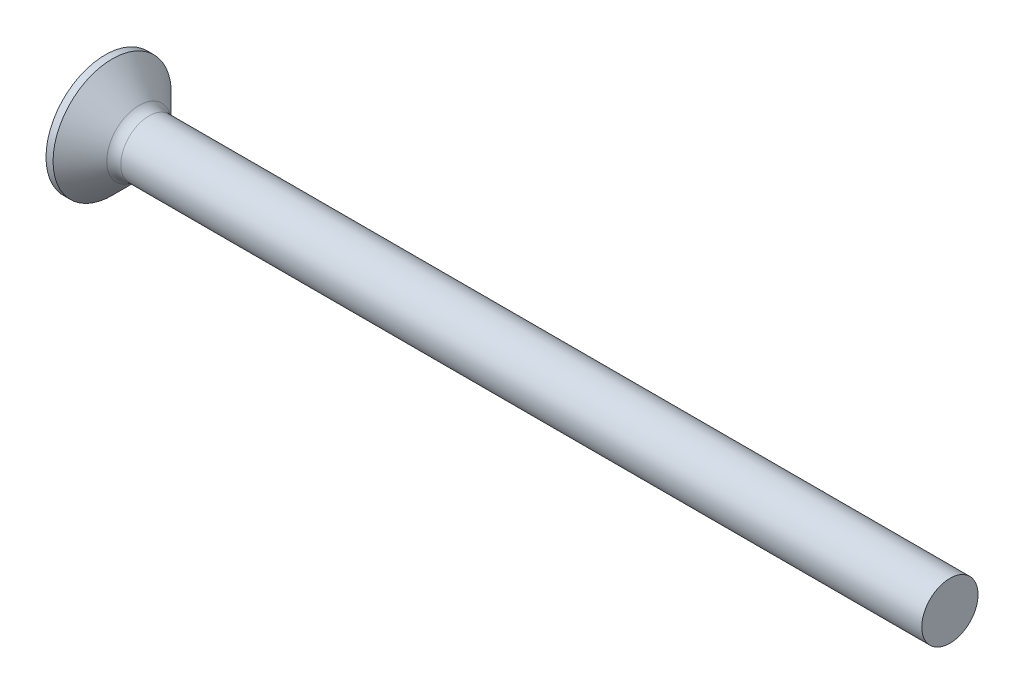
ISO-10303-21;
HEADER;
FILE_DESCRIPTION(('STEP AP214'),'2;1');
FILE_NAME('part.step','',(''),(''),'','','');
FILE_SCHEMA(('AUTOMOTIVE_DESIGN { 1 0 10303 214 1 1 1 1 }'));
ENDSEC;
DATA;
#1=APPLICATION_CONTEXT('core data for automotive mechanical design processes');
#2=APPLICATION_PROTOCOL_DEFINITION('international standard','automotive_design',2000,#1);
#3=PRODUCT_CONTEXT('',#1,'mechanical');
#4=PRODUCT('Part','Part','',(#3));
#5=PRODUCT_RELATED_PRODUCT_CATEGORY('part','',(#4));
#6=PRODUCT_DEFINITION_FORMATION('','',#4);
#7=PRODUCT_DEFINITION_CONTEXT('part definition',#1,'design');
#8=PRODUCT_DEFINITION('design','',#6,#7);
#9=PRODUCT_DEFINITION_SHAPE('','',#8);
#10=(LENGTH_UNIT() NAMED_UNIT(*) SI_UNIT(.MILLI.,.METRE.));
#11=(NAMED_UNIT(*) PLANE_ANGLE_UNIT() SI_UNIT($,.RADIAN.));
#12=(NAMED_UNIT(*) SI_UNIT($,.STERADIAN.) SOLID_ANGLE_UNIT());
#13=UNCERTAINTY_MEASURE_WITH_UNIT(LENGTH_MEASURE(1.E-05),#10,'distance_accuracy_value','');
#14=(GEOMETRIC_REPRESENTATION_CONTEXT(3) GLOBAL_UNCERTAINTY_ASSIGNED_CONTEXT((#13)) GLOBAL_UNIT_ASSIGNED_CONTEXT((#10,
#11,#12)) REPRESENTATION_CONTEXT('',''));
#15=CARTESIAN_POINT('',(0.,0.,0.));
#16=DIRECTION('',(0.,0.,1.));
#17=DIRECTION('',(1.,0.,0.));
#18=AXIS2_PLACEMENT_3D('',#15,#16,#17);
#19=CARTESIAN_POINT('',(9.32000000000001,0.,0.));
#20=DIRECTION('',(-1.,0.,0.));
#21=DIRECTION('',(0.,-1.,0.));
#22=AXIS2_PLACEMENT_3D('',#19,#20,#21);
#23=SPHERICAL_SURFACE('',#22,9.32000000000001);
#24=CARTESIAN_POINT('',(1.,0.,0.));
#25=DIRECTION('',(-1.,0.,0.));
#26=DIRECTION('',(0.,0.,1.));
#27=AXIS2_PLACEMENT_3D('',#24,#25,#26);
#28=CIRCLE('',#27,4.2);
#29=CARTESIAN_POINT('',(1.,0.,4.2));
#30=VERTEX_POINT('',#29);
#31=EDGE_CURVE('E209',#30,#30,#28,.T.);
#32=ORIENTED_EDGE('',*,*,#31,.T.);
#33=EDGE_LOOP('',(#32));
#34=FACE_BOUND('',#33,.T.);
#35=CARTESIAN_POINT('',(9.32000000000001,0.515,0.));
#36=DIRECTION('',(0.,-1.,0.));
#37=DIRECTION('',(0.,0.,-1.));
#38=AXIS2_PLACEMENT_3D('',#35,#36,#37);
#39=CIRCLE('',#38,9.3057603128385);
#40=CARTESIAN_POINT('',(0.314127642384528,0.515000000000009,-2.34338176111737));
#41=VERTEX_POINT('',#40);
#42=CARTESIAN_POINT('',(0.0608783606675705,0.515000000000003,-0.930506027947121));
#43=VERTEX_POINT('',#42);
#44=EDGE_CURVE('E290',#41,#43,#39,.F.);
#45=ORIENTED_EDGE('',*,*,#44,.T.);
#46=CARTESIAN_POINT('',(0.0608783606675708,0.,0.));
#47=DIRECTION('',(1.,0.,0.));
#48=DIRECTION('',(0.,0.,-1.));
#49=AXIS2_PLACEMENT_3D('',#46,#47,#48);
#50=CIRCLE('',#49,1.06351608734703);
#51=CARTESIAN_POINT('',(0.0608783606675708,0.930506027947133,-0.515));
#52=VERTEX_POINT('',#51);
#53=EDGE_CURVE('E319',#43,#52,#50,.T.);
#54=ORIENTED_EDGE('',*,*,#53,.T.);
#55=CARTESIAN_POINT('',(9.32000000000001,0.,-0.515));
#56=DIRECTION('',(0.,0.,1.));
#57=DIRECTION('',(1.,0.,0.));
#58=AXIS2_PLACEMENT_3D('',#55,#56,#57);
#59=CIRCLE('',#58,9.3057603128385);
#60=CARTESIAN_POINT('',(0.314127642384537,2.34338176111741,-0.515));
#61=VERTEX_POINT('',#60);
#62=EDGE_CURVE('E231',#52,#61,#59,.F.);
#63=ORIENTED_EDGE('',*,*,#62,.T.);
#64=CARTESIAN_POINT('',(8.4627527920284,-1.71937218999577,0.));
#65=DIRECTION('',(0.446197753347395,0.894934391398463,0.));
#66=DIRECTION('',(-0.894934391398463,0.446197753347395,0.));
#67=AXIS2_PLACEMENT_3D('',#64,#65,#66);
#68=CIRCLE('',#67,9.11982930194936);
#69=CARTESIAN_POINT('',(0.314127642384539,2.3433817611174,0.514999999999999));
#70=VERTEX_POINT('',#69);
#71=EDGE_CURVE('E235',#70,#61,#68,.F.);
#72=ORIENTED_EDGE('',*,*,#71,.F.);
#73=CARTESIAN_POINT('',(9.32000000000001,0.,0.515));
#74=DIRECTION('',(0.,0.,-1.));
#75=DIRECTION('',(0.,1.,0.));
#76=AXIS2_PLACEMENT_3D('',#73,#74,#75);
#77=CIRCLE('',#76,9.3057603128385);
#78=CARTESIAN_POINT('',(0.0608783606675708,0.930506027947134,0.515));
#79=VERTEX_POINT('',#78);
#80=EDGE_CURVE('E228',#70,#79,#77,.F.);
#81=ORIENTED_EDGE('',*,*,#80,.T.);
#82=CARTESIAN_POINT('',(0.0608783606675709,0.514999999999997,0.930506027947125));
#83=VERTEX_POINT('',#82);
#84=EDGE_CURVE('E345',#79,#83,#50,.T.);
#85=ORIENTED_EDGE('',*,*,#84,.T.);
#86=CARTESIAN_POINT('',(0.314127642384537,0.514999999999992,2.34338176111741));
#87=VERTEX_POINT('',#86);
#88=EDGE_CURVE('E256',#83,#87,#39,.F.);
#89=ORIENTED_EDGE('',*,*,#88,.T.);
#90=CARTESIAN_POINT('',(8.4627527920284,0.,-1.71937218999577));
#91=DIRECTION('',(0.446197753347395,0.,0.894934391398463));
#92=DIRECTION('',(0.894934391398463,0.,-0.446197753347395));
#93=AXIS2_PLACEMENT_3D('',#90,#91,#92);
#94=CIRCLE('',#93,9.11982930194936);
#95=CARTESIAN_POINT('',(0.314127642384539,-0.515000000000007,2.3433817611174));
#96=VERTEX_POINT('',#95);
#97=EDGE_CURVE('E53',#96,#87,#94,.F.);
#98=ORIENTED_EDGE('',*,*,#97,.F.);
#99=CARTESIAN_POINT('',(9.32000000000001,-0.515,0.));
#100=DIRECTION('',(0.,1.,0.));
#101=DIRECTION('',(0.,0.,1.));
#102=AXIS2_PLACEMENT_3D('',#99,#100,#101);
#103=CIRCLE('',#102,9.3057603128385);
#104=CARTESIAN_POINT('',(0.0608783606675688,-0.515000000000003,0.930506027947121));
#105=VERTEX_POINT('',#104);
#106=EDGE_CURVE('E259',#96,#105,#103,.F.);
#107=ORIENTED_EDGE('',*,*,#106,.T.);
#108=CARTESIAN_POINT('',(0.0608783606675708,-0.930506027947134,0.514999999999999));
#109=VERTEX_POINT('',#108);
#110=EDGE_CURVE('E380',#105,#109,#50,.T.);
#111=ORIENTED_EDGE('',*,*,#110,.T.);
#112=CARTESIAN_POINT('',(0.314127642384528,-2.34338176111737,0.514999999999999));
#113=VERTEX_POINT('',#112);
#114=EDGE_CURVE('E227',#109,#113,#77,.F.);
#115=ORIENTED_EDGE('',*,*,#114,.T.);
#116=CARTESIAN_POINT('',(8.46275279202785,1.71937218999647,0.));
#117=DIRECTION('',(0.446197753347478,-0.894934391398422,0.));
#118=DIRECTION('',(0.894934391398422,0.446197753347478,0.));
#119=AXIS2_PLACEMENT_3D('',#116,#117,#118);
#120=CIRCLE('',#119,9.11982930194917);
#121=CARTESIAN_POINT('',(0.314127642384528,-2.34338176111737,-0.515));
#122=VERTEX_POINT('',#121);
#123=EDGE_CURVE('E225',#122,#113,#120,.F.);
#124=ORIENTED_EDGE('',*,*,#123,.F.);
#125=CARTESIAN_POINT('',(0.0608783606675708,-0.930506027947133,-0.515));
#126=VERTEX_POINT('',#125);
#127=EDGE_CURVE('E232',#122,#126,#59,.F.);
#128=ORIENTED_EDGE('',*,*,#127,.T.);
#129=CARTESIAN_POINT('',(0.0608783606675692,-0.514999999999996,-0.930506027947125));
#130=VERTEX_POINT('',#129);
#131=EDGE_CURVE('E340',#126,#130,#50,.T.);
#132=ORIENTED_EDGE('',*,*,#131,.T.);
#133=CARTESIAN_POINT('',(0.314127642384528,-0.514999999999991,-2.34338176111738));
#134=VERTEX_POINT('',#133);
#135=EDGE_CURVE('E261',#130,#134,#103,.F.);
#136=ORIENTED_EDGE('',*,*,#135,.T.);
#137=CARTESIAN_POINT('',(8.46275279202785,0.,1.71937218999647));
#138=DIRECTION('',(0.446197753347478,0.,-0.894934391398422));
#139=DIRECTION('',(-0.894934391398422,0.,-0.446197753347478));
#140=AXIS2_PLACEMENT_3D('',#137,#138,#139);
#141=CIRCLE('',#140,9.11982930194917);
#142=EDGE_CURVE('E238',#41,#134,#141,.F.);
#143=ORIENTED_EDGE('',*,*,#142,.F.);
#144=EDGE_LOOP('',(#45,#54,#63,#72,#81,#85,#89,#98,#107,#111,#115,#124,#128,#132,#136,#143));
#145=FACE_BOUND('',#144,.T.);
#146=ADVANCED_FACE('F39',(#34,#145),#23,.T.);
#147=CARTESIAN_POINT('',(3.1,0.954397273508,-0.515));
#148=DIRECTION('',(0.,0.,1.));
#149=DIRECTION('',(1.,0.,0.));
#150=AXIS2_PLACEMENT_3D('',#147,#148,#149);
#151=PLANE('',#150);
#152=ORIENTED_EDGE('',*,*,#62,.F.);
#153=CARTESIAN_POINT('',(-1.51350935868061,1.05457609529703,-0.515));
#154=CARTESIAN_POINT('',(-1.19095756898956,1.02946929695738,-0.515));
#155=CARTESIAN_POINT('',(-0.868418100655429,1.00420218778782,-0.515));
#156=CARTESIAN_POINT('',(-0.223370410701536,0.953235962920824,-0.515));
#157=CARTESIAN_POINT('',(0.0991378106119179,0.927536843349417,-0.515));
#158=CARTESIAN_POINT('',(0.744110602564962,0.875595660283786,-0.515));
#159=CARTESIAN_POINT('',(1.06657517320613,0.849353596809246,-0.515));
#160=CARTESIAN_POINT('',(1.71144366881837,0.796155443949035,-0.515));
#161=CARTESIAN_POINT('',(2.03384759413784,0.769199358799846,-0.515));
#162=CARTESIAN_POINT('',(2.59585161484893,0.721356774291739,-0.515));
#163=CARTESIAN_POINT('',(2.83547018368547,0.700687775889177,-0.515));
#164=CARTESIAN_POINT('',(3.31464494543874,0.658646734801249,-0.515));
#165=CARTESIAN_POINT('',(3.55420113855084,0.637274694345302,-0.515));
#166=CARTESIAN_POINT('',(4.0332358507464,0.593604611178464,-0.515));
#167=CARTESIAN_POINT('',(4.27271436777158,0.571306545674764,-0.515));
#168=CARTESIAN_POINT('',(4.75154290591158,0.525345817751327,-0.515));
#169=CARTESIAN_POINT('',(4.99089292544568,0.501683138916144,-0.515));
#170=CARTESIAN_POINT('',(5.23015335451577,0.477118870369911,-0.515));
#171=B_SPLINE_CURVE_WITH_KNOTS('',3,(#153,#154,#155,#156,#157,#158,#159,#160,#161,#162,#163,
#164,#165,#166,#167,#168,#169,#170),.UNSPECIFIED.,.F.,.F.,(4,2,2,2,2,2,2,2,4),(0.,
0.970582535235105,1.94117377862305,2.91176498682315,3.88235043753319,4.60387465387785,
5.32539658241397,6.04693628073922,6.76848466054722),.UNSPECIFIED.);
#172=CARTESIAN_POINT('',(3.1,0.677477674908922,-0.514999999999999));
#173=VERTEX_POINT('',#172);
#174=EDGE_CURVE('E367',#52,#173,#171,.T.);
#175=ORIENTED_EDGE('',*,*,#174,.T.);
#176=DIRECTION('',(0.,1.,0.));
#177=VECTOR('',#176,1.);
#178=CARTESIAN_POINT('',(3.1,-0.954397273507642,-0.515));
#179=LINE('',#178,#177);
#180=CARTESIAN_POINT('',(3.1,0.954397273508,-0.515));
#181=VERTEX_POINT('',#180);
#182=EDGE_CURVE('E310',#173,#181,#179,.T.);
#183=ORIENTED_EDGE('',*,*,#182,.T.);
#184=DIRECTION('',(0.894934391398463,-0.446197753347395,0.));
#185=VECTOR('',#184,1.);
#186=CARTESIAN_POINT('',(0.,2.5,-0.515));
#187=LINE('',#186,#185);
#188=EDGE_CURVE('E206',#61,#181,#187,.T.);
#189=ORIENTED_EDGE('',*,*,#188,.F.);
#190=EDGE_LOOP('',(#152,#175,#183,#189));
#191=FACE_BOUND('',#190,.T.);
#192=ADVANCED_FACE('F174',(#191),#151,.T.);
#193=CARTESIAN_POINT('',(3.1,-0.954397273507642,-0.515));
#194=VERTEX_POINT('',#193);
#195=CARTESIAN_POINT('',(3.1,-0.677477674908922,-0.514999999999999));
#196=VERTEX_POINT('',#195);
#197=EDGE_CURVE('E215',#194,#196,#179,.T.);
#198=ORIENTED_EDGE('',*,*,#197,.T.);
#199=CARTESIAN_POINT('',(-1.51350935868061,-1.05457609529703,-0.515));
#200=CARTESIAN_POINT('',(-1.19095756898956,-1.02946929695738,-0.515));
#201=CARTESIAN_POINT('',(-0.868418100655429,-1.00420218778782,-0.515));
#202=CARTESIAN_POINT('',(-0.223370410701536,-0.953235962920824,-0.515));
#203=CARTESIAN_POINT('',(0.0991378106119181,-0.927536843349417,-0.515));
#204=CARTESIAN_POINT('',(0.744110602564962,-0.875595660283786,-0.515));
#205=CARTESIAN_POINT('',(1.06657517320613,-0.849353596809246,-0.515));
#206=CARTESIAN_POINT('',(1.71144366881837,-0.796155443949035,-0.515));
#207=CARTESIAN_POINT('',(2.03384759413784,-0.769199358799846,-0.515));
#208=CARTESIAN_POINT('',(2.59585161484893,-0.721356774291739,-0.515));
#209=CARTESIAN_POINT('',(2.83547018368547,-0.700687775889177,-0.515));
#210=CARTESIAN_POINT('',(3.31464494543874,-0.658646734801249,-0.515));
#211=CARTESIAN_POINT('',(3.55420113855084,-0.637274694345302,-0.515));
#212=CARTESIAN_POINT('',(4.0332358507464,-0.593604611178464,-0.515));
#213=CARTESIAN_POINT('',(4.27271436777158,-0.571306545674764,-0.515));
#214=CARTESIAN_POINT('',(4.75154290591158,-0.525345817751326,-0.515));
#215=CARTESIAN_POINT('',(4.99089292544568,-0.501683138916144,-0.515));
#216=CARTESIAN_POINT('',(5.23015335451577,-0.477118870369911,-0.515));
#217=B_SPLINE_CURVE_WITH_KNOTS('',3,(#199,#200,#201,#202,#203,#204,#205,#206,#207,#208,#209,
#210,#211,#212,#213,#214,#215,#216),.UNSPECIFIED.,.F.,.F.,(4,2,2,2,2,2,2,2,4),(0.,
0.970582535235105,1.94117377862305,2.91176498682315,3.88235043753319,4.60387465387785,
5.32539658241397,6.04693628073923,6.76848466054722),.UNSPECIFIED.);
#218=EDGE_CURVE('E344',#196,#126,#217,.F.);
#219=ORIENTED_EDGE('',*,*,#218,.T.);
#220=ORIENTED_EDGE('',*,*,#127,.F.);
#221=DIRECTION('',(0.894934391398422,0.446197753347478,0.));
#222=VECTOR('',#221,1.);
#223=CARTESIAN_POINT('',(0.,-2.5,-0.515));
#224=LINE('',#223,#222);
#225=EDGE_CURVE('E68',#122,#194,#224,.T.);
#226=ORIENTED_EDGE('',*,*,#225,.T.);
#227=EDGE_LOOP('',(#198,#219,#220,#226));
#228=FACE_BOUND('',#227,.T.);
#229=ADVANCED_FACE('F180',(#228),#151,.T.);
#230=CARTESIAN_POINT('',(3.1,-0.954397273507643,0.515));
#231=DIRECTION('',(0.,0.,-1.));
#232=DIRECTION('',(0.,1.,0.));
#233=AXIS2_PLACEMENT_3D('',#230,#231,#232);
#234=PLANE('',#233);
#235=DIRECTION('',(0.,-1.,0.));
#236=VECTOR('',#235,1.);
#237=CARTESIAN_POINT('',(3.1,0.954397273508,0.515));
#238=LINE('',#237,#236);
#239=CARTESIAN_POINT('',(3.1,0.954397273508,0.515));
#240=VERTEX_POINT('',#239);
#241=CARTESIAN_POINT('',(3.1,0.677477674908922,0.514999999999999));
#242=VERTEX_POINT('',#241);
#243=EDGE_CURVE('E300',#240,#242,#238,.T.);
#244=ORIENTED_EDGE('',*,*,#243,.T.);
#245=CARTESIAN_POINT('',(-1.51350936111664,1.0545760954866,0.515));
#246=CARTESIAN_POINT('',(-1.19095757112503,1.02946929712442,0.515));
#247=CARTESIAN_POINT('',(-0.868418102490365,1.00420218793212,0.515));
#248=CARTESIAN_POINT('',(-0.223370411935422,0.953235963019011,0.515));
#249=CARTESIAN_POINT('',(0.0991378096785384,0.927536843424223,0.515));
#250=CARTESIAN_POINT('',(0.744110602455236,0.875595660292983,0.515));
#251=CARTESIAN_POINT('',(1.06657517361952,0.849353596775841,0.515));
#252=CARTESIAN_POINT('',(1.71144367027778,0.796155443827941,0.515));
#253=CARTESIAN_POINT('',(2.03384759612015,0.769199358633667,0.515));
#254=CARTESIAN_POINT('',(2.59585161735381,0.721356774076593,0.515));
#255=CARTESIAN_POINT('',(2.83547018619018,0.70068777567191,0.515));
#256=CARTESIAN_POINT('',(3.31464494794304,0.658646734579057,0.515));
#257=CARTESIAN_POINT('',(3.5542011410549,0.637274694120309,0.515));
#258=CARTESIAN_POINT('',(4.03323585324989,0.593604610946871,0.515));
#259=CARTESIAN_POINT('',(4.27271437027475,0.571306545439373,0.515));
#260=CARTESIAN_POINT('',(4.7515429084139,0.525345817506525,0.515));
#261=CARTESIAN_POINT('',(4.99089292794747,0.501683138665729,0.515));
#262=CARTESIAN_POINT('',(5.23015335701689,0.477118870112565,0.515));
#263=B_SPLINE_CURVE_WITH_KNOTS('',3,(#245,#246,#247,#248,#249,#250,#251,#252,#253,#254,#255,
#256,#257,#258,#259,#260,#261,#262),.UNSPECIFIED.,.F.,.F.,(4,2,2,2,2,2,2,2,4),(0.,
0.970582536139303,1.94117378043149,2.91176499020614,3.88235044249068,4.60387465883538,
5.32539658737152,6.04693628569684,6.76848466550493),.UNSPECIFIED.);
#264=EDGE_CURVE('E266',#242,#79,#263,.F.);
#265=ORIENTED_EDGE('',*,*,#264,.T.);
#266=ORIENTED_EDGE('',*,*,#80,.F.);
#267=DIRECTION('',(0.894934391398463,-0.446197753347395,0.));
#268=VECTOR('',#267,1.);
#269=CARTESIAN_POINT('',(0.,2.5,0.515));
#270=LINE('',#269,#268);
#271=EDGE_CURVE('E212',#70,#240,#270,.T.);
#272=ORIENTED_EDGE('',*,*,#271,.T.);
#273=EDGE_LOOP('',(#244,#265,#266,#272));
#274=FACE_BOUND('',#273,.T.);
#275=ADVANCED_FACE('F363',(#274),#234,.T.);
#276=ORIENTED_EDGE('',*,*,#114,.F.);
#277=CARTESIAN_POINT('',(-1.51350936111664,-1.0545760954866,0.514999999999999));
#278=CARTESIAN_POINT('',(-1.19095757112503,-1.02946929712442,0.514999999999999));
#279=CARTESIAN_POINT('',(-0.868418102490365,-1.00420218793212,0.514999999999999));
#280=CARTESIAN_POINT('',(-0.223370411935422,-0.953235963019011,0.514999999999999));
#281=CARTESIAN_POINT('',(0.0991378096785389,-0.927536843424223,0.514999999999999));
#282=CARTESIAN_POINT('',(0.744110602455235,-0.875595660292983,0.514999999999999));
#283=CARTESIAN_POINT('',(1.06657517361952,-0.849353596775841,0.514999999999999));
#284=CARTESIAN_POINT('',(1.71144367027778,-0.796155443827941,0.514999999999999));
#285=CARTESIAN_POINT('',(2.03384759612015,-0.769199358633667,0.515));
#286=CARTESIAN_POINT('',(2.59585161735381,-0.721356774076593,0.515));
#287=CARTESIAN_POINT('',(2.83547018619018,-0.70068777567191,0.515));
#288=CARTESIAN_POINT('',(3.31464494794304,-0.658646734579058,0.515));
#289=CARTESIAN_POINT('',(3.5542011410549,-0.637274694120309,0.515));
#290=CARTESIAN_POINT('',(4.03323585324989,-0.593604610946871,0.515));
#291=CARTESIAN_POINT('',(4.27271437027475,-0.571306545439373,0.515));
#292=CARTESIAN_POINT('',(4.7515429084139,-0.525345817506525,0.515));
#293=CARTESIAN_POINT('',(4.99089292794747,-0.501683138665729,0.515));
#294=CARTESIAN_POINT('',(5.23015335701689,-0.477118870112566,0.515));
#295=B_SPLINE_CURVE_WITH_KNOTS('',3,(#277,#278,#279,#280,#281,#282,#283,#284,#285,#286,#287,
#288,#289,#290,#291,#292,#293,#294),.UNSPECIFIED.,.F.,.F.,(4,2,2,2,2,2,2,2,4),(0.,
0.970582536139303,1.94117378043149,2.91176499020613,3.88235044249068,4.60387465883538,
5.32539658737152,6.04693628569685,6.76848466550493),.UNSPECIFIED.);
#296=CARTESIAN_POINT('',(3.1,-0.677477674908922,0.514999999999999));
#297=VERTEX_POINT('',#296);
#298=EDGE_CURVE('E381',#109,#297,#295,.T.);
#299=ORIENTED_EDGE('',*,*,#298,.T.);
#300=CARTESIAN_POINT('',(3.1,-0.954397273507643,0.515));
#301=VERTEX_POINT('',#300);
#302=EDGE_CURVE('E302',#297,#301,#238,.T.);
#303=ORIENTED_EDGE('',*,*,#302,.T.);
#304=DIRECTION('',(0.894934391398422,0.446197753347478,0.));
#305=VECTOR('',#304,1.);
#306=CARTESIAN_POINT('',(0.,-2.5,0.514999999999999));
#307=LINE('',#306,#305);
#308=EDGE_CURVE('E294',#113,#301,#307,.T.);
#309=ORIENTED_EDGE('',*,*,#308,.F.);
#310=EDGE_LOOP('',(#276,#299,#303,#309));
#311=FACE_BOUND('',#310,.T.);
#312=ADVANCED_FACE('F491',(#311),#234,.T.);
#313=CARTESIAN_POINT('',(3.1,0.954397273508,-0.515));
#314=DIRECTION('',(-1.,0.,0.));
#315=DIRECTION('',(0.,0.,1.));
#316=AXIS2_PLACEMENT_3D('',#313,#314,#315);
#317=PLANE('',#316);
#318=ORIENTED_EDGE('',*,*,#302,.F.);
#319=CARTESIAN_POINT('',(3.1,0.,0.));
#320=DIRECTION('',(-1.,0.,0.));
#321=DIRECTION('',(0.,0.,1.));
#322=AXIS2_PLACEMENT_3D('',#319,#320,#321);
#323=CIRCLE('',#322,0.850999999999999);
#324=EDGE_CURVE('E337',#196,#297,#323,.T.);
#325=ORIENTED_EDGE('',*,*,#324,.F.);
#326=ORIENTED_EDGE('',*,*,#197,.F.);
#327=DIRECTION('',(0.,0.,1.));
#328=VECTOR('',#327,1.);
#329=CARTESIAN_POINT('',(3.1,-0.954397273507642,-0.515));
#330=LINE('',#329,#328);
#331=EDGE_CURVE('E297',#194,#301,#330,.T.);
#332=ORIENTED_EDGE('',*,*,#331,.T.);
#333=EDGE_LOOP('',(#318,#325,#326,#332));
#334=FACE_BOUND('',#333,.T.);
#335=ADVANCED_FACE('F411',(#334),#317,.T.);
#336=DIRECTION('',(0.,0.,-1.));
#337=VECTOR('',#336,1.);
#338=CARTESIAN_POINT('',(3.1,-0.515000000000003,0.954397273507998));
#339=LINE('',#338,#337);
#340=CARTESIAN_POINT('',(3.1,-0.514999999999997,-0.677477674908925));
#341=VERTEX_POINT('',#340);
#342=CARTESIAN_POINT('',(3.1,-0.514999999999996,-0.954397273507644));
#343=VERTEX_POINT('',#342);
#344=EDGE_CURVE('E284',#341,#343,#339,.T.);
#345=ORIENTED_EDGE('',*,*,#344,.F.);
#346=CARTESIAN_POINT('',(3.1,0.515000000000002,-0.677477674908919));
#347=VERTEX_POINT('',#346);
#348=EDGE_CURVE('E60',#347,#341,#323,.T.);
#349=ORIENTED_EDGE('',*,*,#348,.F.);
#350=DIRECTION('',(0.,0.,1.));
#351=VECTOR('',#350,1.);
#352=CARTESIAN_POINT('',(3.1,0.515000000000003,-0.95439727350764));
#353=LINE('',#352,#351);
#354=CARTESIAN_POINT('',(3.1,0.515000000000003,-0.95439727350764));
#355=VERTEX_POINT('',#354);
#356=EDGE_CURVE('E287',#355,#347,#353,.T.);
#357=ORIENTED_EDGE('',*,*,#356,.F.);
#358=DIRECTION('',(0.,-1.,0.));
#359=VECTOR('',#358,1.);
#360=CARTESIAN_POINT('',(3.1,0.515000000000003,-0.95439727350764));
#361=LINE('',#360,#359);
#362=EDGE_CURVE('E278',#355,#343,#361,.T.);
#363=ORIENTED_EDGE('',*,*,#362,.T.);
#364=EDGE_LOOP('',(#345,#349,#357,#363));
#365=FACE_BOUND('',#364,.T.);
#366=ADVANCED_FACE('F332',(#365),#317,.T.);
#367=ORIENTED_EDGE('',*,*,#182,.F.);
#368=EDGE_CURVE('E336',#242,#173,#323,.T.);
#369=ORIENTED_EDGE('',*,*,#368,.F.);
#370=ORIENTED_EDGE('',*,*,#243,.F.);
#371=DIRECTION('',(0.,0.,-1.));
#372=VECTOR('',#371,1.);
#373=CARTESIAN_POINT('',(3.1,0.954397273508,0.515));
#374=LINE('',#373,#372);
#375=EDGE_CURVE('E303',#240,#181,#374,.T.);
#376=ORIENTED_EDGE('',*,*,#375,.T.);
#377=EDGE_LOOP('',(#367,#369,#370,#376));
#378=FACE_BOUND('',#377,.T.);
#379=ADVANCED_FACE('F412',(#378),#317,.T.);
#380=CARTESIAN_POINT('',(3.1,0.514999999999997,0.954397273508002));
#381=DIRECTION('',(0.,-1.,0.));
#382=DIRECTION('',(1.,0.,0.));
#383=AXIS2_PLACEMENT_3D('',#380,#381,#382);
#384=PLANE('',#383);
#385=ORIENTED_EDGE('',*,*,#88,.F.);
#386=CARTESIAN_POINT('',(-1.51350936111664,0.514999999999996,1.0545760954866));
#387=CARTESIAN_POINT('',(-1.19095757112503,0.514999999999996,1.02946929712442));
#388=CARTESIAN_POINT('',(-0.868418102490364,0.514999999999996,1.00420218793213));
#389=CARTESIAN_POINT('',(-0.223370411935422,0.514999999999997,0.953235963019013));
#390=CARTESIAN_POINT('',(0.0991378096785389,0.514999999999997,0.927536843424224));
#391=CARTESIAN_POINT('',(0.744110602455236,0.514999999999997,0.875595660292985));
#392=CARTESIAN_POINT('',(1.06657517361952,0.514999999999997,0.849353596775843));
#393=CARTESIAN_POINT('',(1.71144367027778,0.514999999999997,0.796155443827943));
#394=CARTESIAN_POINT('',(2.03384759612015,0.514999999999997,0.769199358633668));
#395=CARTESIAN_POINT('',(2.59585161735381,0.514999999999998,0.721356774076594));
#396=CARTESIAN_POINT('',(2.83547018619018,0.514999999999998,0.700687775671911));
#397=CARTESIAN_POINT('',(3.31464494794304,0.514999999999998,0.658646734579059));
#398=CARTESIAN_POINT('',(3.5542011410549,0.514999999999998,0.63727469412031));
#399=CARTESIAN_POINT('',(4.03323585324989,0.514999999999998,0.593604610946873));
#400=CARTESIAN_POINT('',(4.27271437027475,0.514999999999998,0.571306545439375));
#401=CARTESIAN_POINT('',(4.7515429084139,0.514999999999998,0.525345817506527));
#402=CARTESIAN_POINT('',(4.99089292794747,0.514999999999998,0.501683138665731));
#403=CARTESIAN_POINT('',(5.23015335701689,0.514999999999998,0.477118870112567));
#404=B_SPLINE_CURVE_WITH_KNOTS('',3,(#386,#387,#388,#389,#390,#391,#392,#393,#394,#395,#396,
#397,#398,#399,#400,#401,#402,#403),.UNSPECIFIED.,.F.,.F.,(4,2,2,2,2,2,2,2,4),(0.,
0.970582536139303,1.94117378043149,2.91176499020614,3.88235044249068,4.60387465883538,
5.32539658737152,6.04693628569684,6.76848466550493),.UNSPECIFIED.);
#405=CARTESIAN_POINT('',(3.1,0.514999999999998,0.677477674908923));
#406=VERTEX_POINT('',#405);
#407=EDGE_CURVE('E621',#83,#406,#404,.T.);
#408=ORIENTED_EDGE('',*,*,#407,.T.);
#409=CARTESIAN_POINT('',(3.1,0.514999999999997,0.954397273508002));
#410=VERTEX_POINT('',#409);
#411=EDGE_CURVE('E258',#406,#410,#353,.T.);
#412=ORIENTED_EDGE('',*,*,#411,.T.);
#413=DIRECTION('',(0.894934391398463,0.,-0.446197753347395));
#414=VECTOR('',#413,1.);
#415=CARTESIAN_POINT('',(0.,0.514999999999991,2.5));
#416=LINE('',#415,#414);
#417=EDGE_CURVE('E248',#87,#410,#416,.T.);
#418=ORIENTED_EDGE('',*,*,#417,.F.);
#419=EDGE_LOOP('',(#385,#408,#412,#418));
#420=FACE_BOUND('',#419,.T.);
#421=ADVANCED_FACE('F254',(#420),#384,.T.);
#422=CARTESIAN_POINT('',(3.1,-0.514999999999996,-0.954397273507644));
#423=DIRECTION('',(0.,1.,0.));
#424=DIRECTION('',(0.,0.,1.));
#425=AXIS2_PLACEMENT_3D('',#422,#423,#424);
#426=PLANE('',#425);
#427=CARTESIAN_POINT('',(3.1,-0.515000000000003,0.954397273507998));
#428=VERTEX_POINT('',#427);
#429=CARTESIAN_POINT('',(3.1,-0.515000000000002,0.677477674908919));
#430=VERTEX_POINT('',#429);
#431=EDGE_CURVE('E281',#428,#430,#339,.T.);
#432=ORIENTED_EDGE('',*,*,#431,.T.);
#433=CARTESIAN_POINT('',(-1.51350935868061,-0.515000000000003,1.05457609529703));
#434=CARTESIAN_POINT('',(-1.19095756898956,-0.515000000000003,1.02946929695738));
#435=CARTESIAN_POINT('',(-0.86841810065543,-0.515000000000003,1.00420218778782));
#436=CARTESIAN_POINT('',(-0.223370410701536,-0.515000000000003,0.953235962920822));
#437=CARTESIAN_POINT('',(0.0991378106119178,-0.515000000000003,0.927536843349415));
#438=CARTESIAN_POINT('',(0.744110602564962,-0.515000000000003,0.875595660283785));
#439=CARTESIAN_POINT('',(1.06657517320613,-0.515000000000003,0.849353596809245));
#440=CARTESIAN_POINT('',(1.71144366881837,-0.515000000000003,0.796155443949033));
#441=CARTESIAN_POINT('',(2.03384759413784,-0.515000000000003,0.769199358799845));
#442=CARTESIAN_POINT('',(2.59585161484893,-0.515000000000002,0.721356774291737));
#443=CARTESIAN_POINT('',(2.83547018368547,-0.515000000000002,0.700687775889176));
#444=CARTESIAN_POINT('',(3.31464494543874,-0.515000000000002,0.658646734801247));
#445=CARTESIAN_POINT('',(3.55420113855084,-0.515000000000002,0.6372746943453));
#446=CARTESIAN_POINT('',(4.0332358507464,-0.515000000000002,0.593604611178463));
#447=CARTESIAN_POINT('',(4.27271436777158,-0.515000000000002,0.571306545674762));
#448=CARTESIAN_POINT('',(4.75154290591158,-0.515000000000002,0.525345817751325));
#449=CARTESIAN_POINT('',(4.99089292544568,-0.515000000000002,0.501683138916142));
#450=CARTESIAN_POINT('',(5.23015335451577,-0.515000000000002,0.477118870369909));
#451=B_SPLINE_CURVE_WITH_KNOTS('',3,(#433,#434,#435,#436,#437,#438,#439,#440,#441,#442,#443,
#444,#445,#446,#447,#448,#449,#450),.UNSPECIFIED.,.F.,.F.,(4,2,2,2,2,2,2,2,4),(0.,
0.970582535235105,1.94117377862305,2.91176498682315,3.88235043753319,4.60387465387785,
5.32539658241397,6.04693628073923,6.76848466054722),.UNSPECIFIED.);
#452=EDGE_CURVE('E373',#430,#105,#451,.F.);
#453=ORIENTED_EDGE('',*,*,#452,.T.);
#454=ORIENTED_EDGE('',*,*,#106,.F.);
#455=DIRECTION('',(0.894934391398463,0.,-0.446197753347395));
#456=VECTOR('',#455,1.);
#457=CARTESIAN_POINT('',(0.,-0.515000000000009,2.5));
#458=LINE('',#457,#456);
#459=EDGE_CURVE('E250',#96,#428,#458,.T.);
#460=ORIENTED_EDGE('',*,*,#459,.T.);
#461=EDGE_LOOP('',(#432,#453,#454,#460));
#462=FACE_BOUND('',#461,.T.);
#463=ADVANCED_FACE('F200',(#462),#426,.T.);
#464=ORIENTED_EDGE('',*,*,#356,.T.);
#465=CARTESIAN_POINT('',(-1.51350936111664,0.515000000000004,-1.0545760954866));
#466=CARTESIAN_POINT('',(-1.19095757112503,0.515000000000004,-1.02946929712441));
#467=CARTESIAN_POINT('',(-0.868418102490364,0.515000000000004,-1.00420218793212));
#468=CARTESIAN_POINT('',(-0.223370411935422,0.515000000000003,-0.953235963019009));
#469=CARTESIAN_POINT('',(0.0991378096785386,0.515000000000003,-0.927536843424221));
#470=CARTESIAN_POINT('',(0.744110602455235,0.515000000000003,-0.875595660292982));
#471=CARTESIAN_POINT('',(1.06657517361952,0.515000000000003,-0.849353596775839));
#472=CARTESIAN_POINT('',(1.71144367027778,0.515000000000003,-0.796155443827939));
#473=CARTESIAN_POINT('',(2.03384759612015,0.515000000000003,-0.769199358633664));
#474=CARTESIAN_POINT('',(2.59585161735381,0.515000000000003,-0.721356774076591));
#475=CARTESIAN_POINT('',(2.83547018619018,0.515000000000003,-0.700687775671908));
#476=CARTESIAN_POINT('',(3.31464494794304,0.515000000000002,-0.658646734579056));
#477=CARTESIAN_POINT('',(3.5542011410549,0.515000000000002,-0.637274694120307));
#478=CARTESIAN_POINT('',(4.03323585324989,0.515000000000002,-0.593604610946869));
#479=CARTESIAN_POINT('',(4.27271437027475,0.515000000000002,-0.571306545439371));
#480=CARTESIAN_POINT('',(4.7515429084139,0.515000000000002,-0.525345817506523));
#481=CARTESIAN_POINT('',(4.99089292794747,0.515000000000002,-0.501683138665727));
#482=CARTESIAN_POINT('',(5.23015335701689,0.515000000000002,-0.477118870112564));
#483=B_SPLINE_CURVE_WITH_KNOTS('',3,(#465,#466,#467,#468,#469,#470,#471,#472,#473,#474,#475,
#476,#477,#478,#479,#480,#481,#482),.UNSPECIFIED.,.F.,.F.,(4,2,2,2,2,2,2,2,4),(0.,
0.970582536139304,1.94117378043149,2.91176499020614,3.88235044249068,4.60387465883538,
5.32539658737152,6.04693628569685,6.76848466550493),.UNSPECIFIED.);
#484=EDGE_CURVE('E325',#347,#43,#483,.F.);
#485=ORIENTED_EDGE('',*,*,#484,.T.);
#486=ORIENTED_EDGE('',*,*,#44,.F.);
#487=DIRECTION('',(0.894934391398422,0.,0.446197753347478));
#488=VECTOR('',#487,1.);
#489=CARTESIAN_POINT('',(0.,0.515000000000009,-2.5));
#490=LINE('',#489,#488);
#491=EDGE_CURVE('E263',#41,#355,#490,.T.);
#492=ORIENTED_EDGE('',*,*,#491,.T.);
#493=EDGE_LOOP('',(#464,#485,#486,#492));
#494=FACE_BOUND('',#493,.T.);
#495=ADVANCED_FACE('F198',(#494),#384,.T.);
#496=ORIENTED_EDGE('',*,*,#135,.F.);
#497=CARTESIAN_POINT('',(-1.51350935868061,-0.514999999999996,-1.05457609529703));
#498=CARTESIAN_POINT('',(-1.19095756898956,-0.514999999999996,-1.02946929695738));
#499=CARTESIAN_POINT('',(-0.86841810065543,-0.514999999999996,-1.00420218778783));
#500=CARTESIAN_POINT('',(-0.223370410701536,-0.514999999999996,-0.953235962920826));
#501=CARTESIAN_POINT('',(0.0991378106119178,-0.514999999999996,-0.927536843349419));
#502=CARTESIAN_POINT('',(0.744110602564962,-0.514999999999996,-0.875595660283788));
#503=CARTESIAN_POINT('',(1.06657517320613,-0.514999999999997,-0.849353596809248));
#504=CARTESIAN_POINT('',(1.71144366881837,-0.514999999999997,-0.796155443949037));
#505=CARTESIAN_POINT('',(2.03384759413784,-0.514999999999997,-0.769199358799848));
#506=CARTESIAN_POINT('',(2.59585161484893,-0.514999999999997,-0.721356774291741));
#507=CARTESIAN_POINT('',(2.83547018368547,-0.514999999999997,-0.700687775889179));
#508=CARTESIAN_POINT('',(3.31464494543874,-0.514999999999997,-0.658646734801251));
#509=CARTESIAN_POINT('',(3.55420113855084,-0.514999999999997,-0.637274694345304));
#510=CARTESIAN_POINT('',(4.0332358507464,-0.514999999999998,-0.593604611178466));
#511=CARTESIAN_POINT('',(4.27271436777158,-0.514999999999998,-0.571306545674766));
#512=CARTESIAN_POINT('',(4.75154290591158,-0.514999999999998,-0.525345817751329));
#513=CARTESIAN_POINT('',(4.99089292544568,-0.514999999999998,-0.501683138916146));
#514=CARTESIAN_POINT('',(5.23015335451577,-0.514999999999998,-0.477118870369913));
#515=B_SPLINE_CURVE_WITH_KNOTS('',3,(#497,#498,#499,#500,#501,#502,#503,#504,#505,#506,#507,
#508,#509,#510,#511,#512,#513,#514),.UNSPECIFIED.,.F.,.F.,(4,2,2,2,2,2,2,2,4),(0.,
0.970582535235105,1.94117377862305,2.91176498682315,3.88235043753319,4.60387465387785,
5.32539658241397,6.04693628073922,6.76848466054722),.UNSPECIFIED.);
#516=EDGE_CURVE('E11',#130,#341,#515,.T.);
#517=ORIENTED_EDGE('',*,*,#516,.T.);
#518=ORIENTED_EDGE('',*,*,#344,.T.);
#519=DIRECTION('',(0.894934391398422,0.,0.446197753347478));
#520=VECTOR('',#519,1.);
#521=CARTESIAN_POINT('',(0.,-0.51499999999999,-2.5));
#522=LINE('',#521,#520);
#523=EDGE_CURVE('E275',#134,#343,#522,.T.);
#524=ORIENTED_EDGE('',*,*,#523,.F.);
#525=EDGE_LOOP('',(#496,#517,#518,#524));
#526=FACE_BOUND('',#525,.T.);
#527=ADVANCED_FACE('F190',(#526),#426,.T.);
#528=CARTESIAN_POINT('',(61.,0.,0.));
#529=DIRECTION('',(-1.,0.,0.));
#530=DIRECTION('',(0.,0.,1.));
#531=AXIS2_PLACEMENT_3D('',#528,#529,#530);
#532=PLANE('',#531);
#533=CARTESIAN_POINT('',(61.,0.,0.));
#534=DIRECTION('',(-1.,0.,0.));
#535=DIRECTION('',(0.,0.,1.));
#536=AXIS2_PLACEMENT_3D('',#533,#534,#535);
#537=CIRCLE('',#536,2.);
#538=CARTESIAN_POINT('',(61.,0.,2.));
#539=VERTEX_POINT('',#538);
#540=EDGE_CURVE('E203',#539,#539,#537,.T.);
#541=ORIENTED_EDGE('',*,*,#540,.F.);
#542=EDGE_LOOP('',(#541));
#543=FACE_BOUND('',#542,.T.);
#544=ADVANCED_FACE('F188',(#543),#532,.F.);
#545=CARTESIAN_POINT('',(-15.875,0.,0.));
#546=DIRECTION('',(-1.,0.,0.));
#547=DIRECTION('',(0.,0.,1.));
#548=AXIS2_PLACEMENT_3D('',#545,#546,#547);
#549=CYLINDRICAL_SURFACE('',#548,4.2);
#550=ORIENTED_EDGE('',*,*,#31,.F.);
#551=EDGE_LOOP('',(#550));
#552=FACE_BOUND('',#551,.T.);
#553=CARTESIAN_POINT('',(1.50000000000001,0.,0.));
#554=DIRECTION('',(-1.,0.,0.));
#555=DIRECTION('',(0.,0.,1.));
#556=AXIS2_PLACEMENT_3D('',#553,#554,#555);
#557=CIRCLE('',#556,4.2);
#558=CARTESIAN_POINT('',(1.50000000000001,0.,4.2));
#559=VERTEX_POINT('',#558);
#560=EDGE_CURVE('E205',#559,#559,#557,.T.);
#561=ORIENTED_EDGE('',*,*,#560,.T.);
#562=EDGE_LOOP('',(#561));
#563=FACE_BOUND('',#562,.T.);
#564=ADVANCED_FACE('F186',(#552,#563),#549,.T.);
#565=CARTESIAN_POINT('',(1.50000000000001,0.,0.));
#566=DIRECTION('',(-1.,0.,0.));
#567=DIRECTION('',(0.,0.,1.));
#568=AXIS2_PLACEMENT_3D('',#565,#566,#567);
#569=CONICAL_SURFACE('',#568,4.2,0.78539816339745);
#570=CARTESIAN_POINT('',(3.40710678118655,0.,0.));
#571=DIRECTION('',(1.,0.,0.));
#572=DIRECTION('',(0.,0.,-1.));
#573=AXIS2_PLACEMENT_3D('',#570,#571,#572);
#574=CIRCLE('',#573,2.29289321881345);
#575=CARTESIAN_POINT('',(3.40710678118655,0.,-2.29289321881345));
#576=VERTEX_POINT('',#575);
#577=EDGE_CURVE('E219',#576,#576,#574,.F.);
#578=ORIENTED_EDGE('',*,*,#577,.T.);
#579=EDGE_LOOP('',(#578));
#580=FACE_BOUND('',#579,.T.);
#581=ORIENTED_EDGE('',*,*,#560,.F.);
#582=EDGE_LOOP('',(#581));
#583=FACE_BOUND('',#582,.T.);
#584=ADVANCED_FACE('F196',(#580,#583),#569,.T.);
#585=CARTESIAN_POINT('',(-15.875,0.,0.));
#586=DIRECTION('',(-1.,0.,0.));
#587=DIRECTION('',(0.,0.,1.));
#588=AXIS2_PLACEMENT_3D('',#585,#586,#587);
#589=CYLINDRICAL_SURFACE('',#588,2.);
#590=CARTESIAN_POINT('',(4.1142135623731,0.,0.));
#591=DIRECTION('',(-1.,0.,0.));
#592=DIRECTION('',(0.,0.,1.));
#593=AXIS2_PLACEMENT_3D('',#590,#591,#592);
#594=CIRCLE('',#593,2.);
#595=CARTESIAN_POINT('',(4.1142135623731,0.,2.));
#596=VERTEX_POINT('',#595);
#597=EDGE_CURVE('E222',#596,#596,#594,.F.);
#598=ORIENTED_EDGE('',*,*,#597,.T.);
#599=EDGE_LOOP('',(#598));
#600=FACE_BOUND('',#599,.T.);
#601=ORIENTED_EDGE('',*,*,#540,.T.);
#602=EDGE_LOOP('',(#601));
#603=FACE_BOUND('',#602,.T.);
#604=ADVANCED_FACE('F413',(#600,#603),#589,.T.);
#605=CARTESIAN_POINT('',(4.1142135623731,0.,0.));
#606=DIRECTION('',(-1.,0.,0.));
#607=DIRECTION('',(0.,0.,1.));
#608=AXIS2_PLACEMENT_3D('',#605,#606,#607);
#609=TOROIDAL_SURFACE('',#608,3.,1.);
#610=ORIENTED_EDGE('',*,*,#597,.F.);
#611=EDGE_LOOP('',(#610));
#612=FACE_BOUND('',#611,.T.);
#613=ORIENTED_EDGE('',*,*,#577,.F.);
#614=EDGE_LOOP('',(#613));
#615=FACE_BOUND('',#614,.T.);
#616=ADVANCED_FACE('F41',(#612,#615),#609,.F.);
#617=ORIENTED_EDGE('',*,*,#411,.F.);
#618=EDGE_CURVE('E341',#430,#406,#323,.T.);
#619=ORIENTED_EDGE('',*,*,#618,.F.);
#620=ORIENTED_EDGE('',*,*,#431,.F.);
#621=DIRECTION('',(0.,1.,0.));
#622=VECTOR('',#621,1.);
#623=CARTESIAN_POINT('',(3.1,-0.515000000000003,0.954397273507998));
#624=LINE('',#623,#622);
#625=EDGE_CURVE('E285',#428,#410,#624,.T.);
#626=ORIENTED_EDGE('',*,*,#625,.T.);
#627=EDGE_LOOP('',(#617,#619,#620,#626));
#628=FACE_BOUND('',#627,.T.);
#629=ADVANCED_FACE('F405',(#628),#317,.T.);
#630=CARTESIAN_POINT('',(3.1,0.954397273508,0.515));
#631=DIRECTION('',(0.446197753347395,0.894934391398463,0.));
#632=DIRECTION('',(-0.894934391398463,0.446197753347395,0.));
#633=AXIS2_PLACEMENT_3D('',#630,#631,#632);
#634=PLANE('',#633);
#635=ORIENTED_EDGE('',*,*,#71,.T.);
#636=ORIENTED_EDGE('',*,*,#188,.T.);
#637=ORIENTED_EDGE('',*,*,#375,.F.);
#638=ORIENTED_EDGE('',*,*,#271,.F.);
#639=EDGE_LOOP('',(#635,#636,#637,#638));
#640=FACE_BOUND('',#639,.T.);
#641=ADVANCED_FACE('F361',(#640),#634,.F.);
#642=CARTESIAN_POINT('',(0.,-2.5,-0.515));
#643=DIRECTION('',(0.446197753347478,-0.894934391398422,0.));
#644=DIRECTION('',(0.894934391398422,0.446197753347478,0.));
#645=AXIS2_PLACEMENT_3D('',#642,#643,#644);
#646=PLANE('',#645);
#647=ORIENTED_EDGE('',*,*,#123,.T.);
#648=ORIENTED_EDGE('',*,*,#308,.T.);
#649=ORIENTED_EDGE('',*,*,#331,.F.);
#650=ORIENTED_EDGE('',*,*,#225,.F.);
#651=EDGE_LOOP('',(#647,#648,#649,#650));
#652=FACE_BOUND('',#651,.T.);
#653=ADVANCED_FACE('F398',(#652),#646,.F.);
#654=CARTESIAN_POINT('',(3.1,-0.515000000000003,0.954397273507998));
#655=DIRECTION('',(0.446197753347395,0.,0.894934391398463));
#656=DIRECTION('',(-0.894934391398463,0.,0.446197753347395));
#657=AXIS2_PLACEMENT_3D('',#654,#655,#656);
#658=PLANE('',#657);
#659=ORIENTED_EDGE('',*,*,#97,.T.);
#660=ORIENTED_EDGE('',*,*,#417,.T.);
#661=ORIENTED_EDGE('',*,*,#625,.F.);
#662=ORIENTED_EDGE('',*,*,#459,.F.);
#663=EDGE_LOOP('',(#659,#660,#661,#662));
#664=FACE_BOUND('',#663,.T.);
#665=ADVANCED_FACE('F246',(#664),#658,.F.);
#666=CARTESIAN_POINT('',(0.,0.515000000000009,-2.5));
#667=DIRECTION('',(0.446197753347478,0.,-0.894934391398422));
#668=DIRECTION('',(0.894934391398422,0.,0.446197753347478));
#669=AXIS2_PLACEMENT_3D('',#666,#667,#668);
#670=PLANE('',#669);
#671=ORIENTED_EDGE('',*,*,#142,.T.);
#672=ORIENTED_EDGE('',*,*,#523,.T.);
#673=ORIENTED_EDGE('',*,*,#362,.F.);
#674=ORIENTED_EDGE('',*,*,#491,.F.);
#675=EDGE_LOOP('',(#671,#672,#673,#674));
#676=FACE_BOUND('',#675,.T.);
#677=ADVANCED_FACE('F327',(#676),#670,.F.);
#678=CARTESIAN_POINT('',(3.1,0.,0.));
#679=DIRECTION('',(-1.,0.,0.));
#680=DIRECTION('',(0.,0.,1.));
#681=AXIS2_PLACEMENT_3D('',#678,#679,#680);
#682=CONICAL_SURFACE('',#681,0.850999999999999,0.0698131700797659);
#683=EDGE_CURVE('E338',#406,#242,#323,.T.);
#684=ORIENTED_EDGE('',*,*,#683,.F.);
#685=ORIENTED_EDGE('',*,*,#407,.F.);
#686=ORIENTED_EDGE('',*,*,#84,.F.);
#687=ORIENTED_EDGE('',*,*,#264,.F.);
#688=EDGE_LOOP('',(#684,#685,#686,#687));
#689=FACE_BOUND('',#688,.T.);
#690=ADVANCED_FACE('F171',(#689),#682,.F.);
#691=ORIENTED_EDGE('',*,*,#110,.F.);
#692=ORIENTED_EDGE('',*,*,#452,.F.);
#693=EDGE_CURVE('E631',#297,#430,#323,.T.);
#694=ORIENTED_EDGE('',*,*,#693,.F.);
#695=ORIENTED_EDGE('',*,*,#298,.F.);
#696=EDGE_LOOP('',(#691,#692,#694,#695));
#697=FACE_BOUND('',#696,.T.);
#698=ADVANCED_FACE('F396',(#697),#682,.F.);
#699=ORIENTED_EDGE('',*,*,#53,.F.);
#700=ORIENTED_EDGE('',*,*,#484,.F.);
#701=EDGE_CURVE('E333',#173,#347,#323,.T.);
#702=ORIENTED_EDGE('',*,*,#701,.F.);
#703=ORIENTED_EDGE('',*,*,#174,.F.);
#704=EDGE_LOOP('',(#699,#700,#702,#703));
#705=FACE_BOUND('',#704,.T.);
#706=ADVANCED_FACE('F169',(#705),#682,.F.);
#707=EDGE_CURVE('E334',#341,#196,#323,.T.);
#708=ORIENTED_EDGE('',*,*,#707,.F.);
#709=ORIENTED_EDGE('',*,*,#516,.F.);
#710=ORIENTED_EDGE('',*,*,#131,.F.);
#711=ORIENTED_EDGE('',*,*,#218,.F.);
#712=EDGE_LOOP('',(#708,#709,#710,#711));
#713=FACE_BOUND('',#712,.T.);
#714=ADVANCED_FACE('F164',(#713),#682,.F.);
#715=CARTESIAN_POINT('',(3.3765066614942,0.,0.));
#716=DIRECTION('',(-1.,0.,0.));
#717=DIRECTION('',(0.,0.,1.));
#718=AXIS2_PLACEMENT_3D('',#715,#716,#717);
#719=CONICAL_SURFACE('',#718,0.,1.25663706143592);
#720=ORIENTED_EDGE('',*,*,#683,.T.);
#721=ORIENTED_EDGE('',*,*,#368,.T.);
#722=ORIENTED_EDGE('',*,*,#701,.T.);
#723=ORIENTED_EDGE('',*,*,#348,.T.);
#724=ORIENTED_EDGE('',*,*,#707,.T.);
#725=ORIENTED_EDGE('',*,*,#324,.T.);
#726=ORIENTED_EDGE('',*,*,#693,.T.);
#727=ORIENTED_EDGE('',*,*,#618,.T.);
#728=EDGE_LOOP('',(#720,#721,#722,#723,#724,#725,#726,#727));
#729=FACE_BOUND('',#728,.T.);
#730=CARTESIAN_POINT('',(3.3765066614942,0.,0.));
#731=VERTEX_POINT('',#730);
#732=VERTEX_LOOP('',#731);
#733=FACE_BOUND('',#732,.T.);
#734=ADVANCED_FACE('F162',(#729,#733),#719,.F.);
#735=CLOSED_SHELL('',(#146,#192,#229,#275,#312,#335,#366,#379,#421,#463,#495,#527,#544,#564,
#584,#604,#616,#629,#641,#653,#665,#677,#690,#698,#706,#714,#734));
#736=MANIFOLD_SOLID_BREP('B2',#735);
#737=ADVANCED_BREP_SHAPE_REPRESENTATION('',(#18,#736),#14);
#738=SHAPE_DEFINITION_REPRESENTATION(#9,#737);
ENDSEC;
END-ISO-10303-21;
